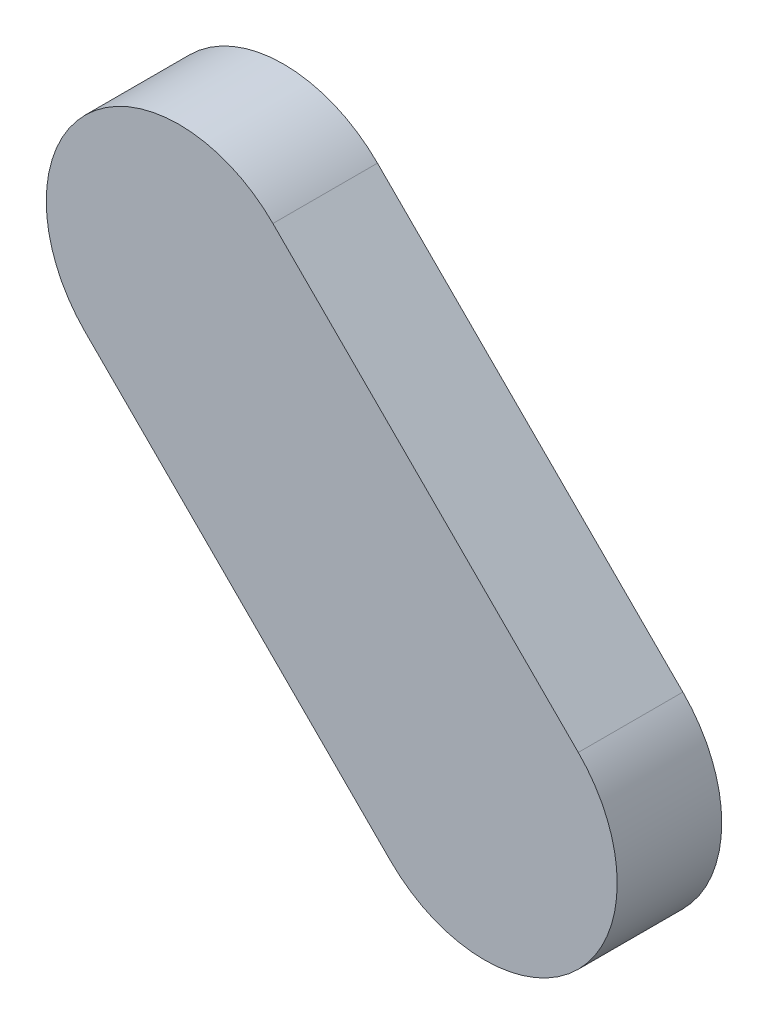
ISO-10303-21;
HEADER;
FILE_DESCRIPTION(('STEP AP214'),'2;1');
FILE_NAME('part.step','',(''),(''),'','','');
FILE_SCHEMA(('AUTOMOTIVE_DESIGN { 1 0 10303 214 1 1 1 1 }'));
ENDSEC;
DATA;
#1=APPLICATION_CONTEXT('core data for automotive mechanical design processes');
#2=APPLICATION_PROTOCOL_DEFINITION('international standard','automotive_design',2000,#1);
#3=PRODUCT_CONTEXT('',#1,'mechanical');
#4=PRODUCT('Part','Part','',(#3));
#5=PRODUCT_RELATED_PRODUCT_CATEGORY('part','',(#4));
#6=PRODUCT_DEFINITION_FORMATION('','',#4);
#7=PRODUCT_DEFINITION_CONTEXT('part definition',#1,'design');
#8=PRODUCT_DEFINITION('design','',#6,#7);
#9=PRODUCT_DEFINITION_SHAPE('','',#8);
#10=(LENGTH_UNIT() NAMED_UNIT(*) SI_UNIT(.MILLI.,.METRE.));
#11=(NAMED_UNIT(*) PLANE_ANGLE_UNIT() SI_UNIT($,.RADIAN.));
#12=(NAMED_UNIT(*) SI_UNIT($,.STERADIAN.) SOLID_ANGLE_UNIT());
#13=UNCERTAINTY_MEASURE_WITH_UNIT(LENGTH_MEASURE(1.E-05),#10,'distance_accuracy_value','');
#14=(GEOMETRIC_REPRESENTATION_CONTEXT(3) GLOBAL_UNCERTAINTY_ASSIGNED_CONTEXT((#13)) GLOBAL_UNIT_ASSIGNED_CONTEXT((#10,
#11,#12)) REPRESENTATION_CONTEXT('',''));
#15=CARTESIAN_POINT('',(0.,0.,0.));
#16=DIRECTION('',(0.,0.,1.));
#17=DIRECTION('',(1.,0.,0.));
#18=AXIS2_PLACEMENT_3D('',#15,#16,#17);
#19=CARTESIAN_POINT('',(137.99639406,56.9703966,0.));
#20=DIRECTION('',(0.70710678118653,0.707106781186565,0.));
#21=DIRECTION('',(0.707106781186565,-0.70710678118653,0.));
#22=AXIS2_PLACEMENT_3D('',#19,#20,#21);
#23=PLANE('',#22);
#24=DIRECTION('',(0.707106781186565,-0.70710678118653,0.));
#25=VECTOR('',#24,1.);
#26=CARTESIAN_POINT('',(137.99639406,56.9703966,0.1999996));
#27=LINE('',#26,#25);
#28=CARTESIAN_POINT('',(137.99639406,56.9703966,0.1999996));
#29=VERTEX_POINT('',#28);
#30=CARTESIAN_POINT('',(138.5805966,56.38619406,0.1999996));
#31=VERTEX_POINT('',#30);
#32=EDGE_CURVE('E11',#29,#31,#27,.T.);
#33=ORIENTED_EDGE('',*,*,#32,.F.);
#34=DIRECTION('',(0.,0.,1.));
#35=VECTOR('',#34,1.);
#36=CARTESIAN_POINT('',(137.99639406,56.9703966,0.));
#37=LINE('',#36,#35);
#38=CARTESIAN_POINT('',(137.99639406,56.9703966,0.));
#39=VERTEX_POINT('',#38);
#40=EDGE_CURVE('E24',#39,#29,#37,.T.);
#41=ORIENTED_EDGE('',*,*,#40,.F.);
#42=DIRECTION('',(0.707106781186565,-0.70710678118653,0.));
#43=VECTOR('',#42,1.);
#44=CARTESIAN_POINT('',(137.99639406,56.9703966,0.));
#45=LINE('',#44,#43);
#46=CARTESIAN_POINT('',(138.5805966,56.38619406,0.));
#47=VERTEX_POINT('',#46);
#48=EDGE_CURVE('E75',#39,#47,#45,.T.);
#49=ORIENTED_EDGE('',*,*,#48,.T.);
#50=DIRECTION('',(0.,0.,1.));
#51=VECTOR('',#50,1.);
#52=CARTESIAN_POINT('',(138.5805966,56.38619406,0.));
#53=LINE('',#52,#51);
#54=EDGE_CURVE('E37',#47,#31,#53,.T.);
#55=ORIENTED_EDGE('',*,*,#54,.T.);
#56=EDGE_LOOP('',(#33,#41,#49,#55));
#57=FACE_BOUND('',#56,.T.);
#58=ADVANCED_FACE('F17',(#57),#23,.F.);
#59=CARTESIAN_POINT('',(138.76020127,56.56579873,0.));
#60=DIRECTION('',(0.,0.,-1.));
#61=DIRECTION('',(-0.707106781186492,-0.707106781186603,0.));
#62=AXIS2_PLACEMENT_3D('',#59,#60,#61);
#63=CYLINDRICAL_SURFACE('',#62,0.253999360179542);
#64=CARTESIAN_POINT('',(138.76020127,56.56579873,0.1999996));
#65=DIRECTION('',(0.,0.,1.));
#66=DIRECTION('',(-0.707106781186492,-0.707106781186603,0.));
#67=AXIS2_PLACEMENT_3D('',#64,#65,#66);
#68=CIRCLE('',#67,0.253999360179542);
#69=CARTESIAN_POINT('',(138.93980594,56.7454034,0.1999996));
#70=VERTEX_POINT('',#69);
#71=EDGE_CURVE('E83',#31,#70,#68,.T.);
#72=ORIENTED_EDGE('',*,*,#71,.F.);
#73=ORIENTED_EDGE('',*,*,#54,.F.);
#74=CARTESIAN_POINT('',(138.76020127,56.56579873,0.));
#75=DIRECTION('',(0.,0.,1.));
#76=DIRECTION('',(-0.707106781186492,-0.707106781186603,0.));
#77=AXIS2_PLACEMENT_3D('',#74,#75,#76);
#78=CIRCLE('',#77,0.253999360179542);
#79=CARTESIAN_POINT('',(138.93980594,56.7454034,0.));
#80=VERTEX_POINT('',#79);
#81=EDGE_CURVE('E81',#47,#80,#78,.T.);
#82=ORIENTED_EDGE('',*,*,#81,.T.);
#83=DIRECTION('',(0.,0.,1.));
#84=VECTOR('',#83,1.);
#85=CARTESIAN_POINT('',(138.93980594,56.7454034,0.));
#86=LINE('',#85,#84);
#87=EDGE_CURVE('E67',#80,#70,#86,.T.);
#88=ORIENTED_EDGE('',*,*,#87,.T.);
#89=EDGE_LOOP('',(#72,#73,#82,#88));
#90=FACE_BOUND('',#89,.T.);
#91=ADVANCED_FACE('F89',(#90),#63,.T.);
#92=CARTESIAN_POINT('',(138.93980594,56.7454034,0.));
#93=DIRECTION('',(-0.707106781186561,-0.707106781186535,0.));
#94=DIRECTION('',(-0.707106781186535,0.707106781186561,0.));
#95=AXIS2_PLACEMENT_3D('',#92,#93,#94);
#96=PLANE('',#95);
#97=DIRECTION('',(-0.707106781186535,0.707106781186561,0.));
#98=VECTOR('',#97,1.);
#99=CARTESIAN_POINT('',(138.93980594,56.7454034,0.1999996));
#100=LINE('',#99,#98);
#101=CARTESIAN_POINT('',(138.3556034,57.32960594,0.1999996));
#102=VERTEX_POINT('',#101);
#103=EDGE_CURVE('E71',#70,#102,#100,.T.);
#104=ORIENTED_EDGE('',*,*,#103,.F.);
#105=ORIENTED_EDGE('',*,*,#87,.F.);
#106=DIRECTION('',(-0.707106781186535,0.707106781186561,0.));
#107=VECTOR('',#106,1.);
#108=CARTESIAN_POINT('',(138.93980594,56.7454034,0.));
#109=LINE('',#108,#107);
#110=CARTESIAN_POINT('',(138.3556034,57.32960594,0.));
#111=VERTEX_POINT('',#110);
#112=EDGE_CURVE('E63',#80,#111,#109,.T.);
#113=ORIENTED_EDGE('',*,*,#112,.T.);
#114=DIRECTION('',(0.,0.,1.));
#115=VECTOR('',#114,1.);
#116=CARTESIAN_POINT('',(138.3556034,57.32960594,0.));
#117=LINE('',#116,#115);
#118=EDGE_CURVE('E53',#111,#102,#117,.T.);
#119=ORIENTED_EDGE('',*,*,#118,.T.);
#120=EDGE_LOOP('',(#104,#105,#113,#119));
#121=FACE_BOUND('',#120,.T.);
#122=ADVANCED_FACE('F66',(#121),#96,.F.);
#123=CARTESIAN_POINT('',(138.17599873,57.15000127,0.));
#124=DIRECTION('',(0.,0.,-1.));
#125=DIRECTION('',(0.707106781186562,0.707106781186534,0.));
#126=AXIS2_PLACEMENT_3D('',#123,#124,#125);
#127=CYLINDRICAL_SURFACE('',#126,0.253999360179559);
#128=CARTESIAN_POINT('',(138.17599873,57.15000127,0.1999996));
#129=DIRECTION('',(0.,0.,1.));
#130=DIRECTION('',(0.707106781186562,0.707106781186534,0.));
#131=AXIS2_PLACEMENT_3D('',#128,#129,#130);
#132=CIRCLE('',#131,0.253999360179559);
#133=EDGE_CURVE('E59',#102,#29,#132,.T.);
#134=ORIENTED_EDGE('',*,*,#133,.F.);
#135=ORIENTED_EDGE('',*,*,#118,.F.);
#136=CARTESIAN_POINT('',(138.17599873,57.15000127,0.));
#137=DIRECTION('',(0.,0.,1.));
#138=DIRECTION('',(0.707106781186562,0.707106781186534,0.));
#139=AXIS2_PLACEMENT_3D('',#136,#137,#138);
#140=CIRCLE('',#139,0.253999360179559);
#141=EDGE_CURVE('E57',#111,#39,#140,.T.);
#142=ORIENTED_EDGE('',*,*,#141,.T.);
#143=ORIENTED_EDGE('',*,*,#40,.T.);
#144=EDGE_LOOP('',(#134,#135,#142,#143));
#145=FACE_BOUND('',#144,.T.);
#146=ADVANCED_FACE('F55',(#145),#127,.T.);
#147=CARTESIAN_POINT('',(137.99639406,56.9703966,0.));
#148=DIRECTION('',(0.,0.,-1.));
#149=DIRECTION('',(-1.,0.,0.));
#150=AXIS2_PLACEMENT_3D('',#147,#148,#149);
#151=PLANE('',#150);
#152=ORIENTED_EDGE('',*,*,#141,.F.);
#153=ORIENTED_EDGE('',*,*,#112,.F.);
#154=ORIENTED_EDGE('',*,*,#81,.F.);
#155=ORIENTED_EDGE('',*,*,#48,.F.);
#156=EDGE_LOOP('',(#152,#153,#154,#155));
#157=FACE_BOUND('',#156,.T.);
#158=ADVANCED_FACE('F74',(#157),#151,.T.);
#159=CARTESIAN_POINT('',(137.99639406,56.9703966,0.1999996));
#160=DIRECTION('',(0.,0.,-1.));
#161=DIRECTION('',(-1.,0.,0.));
#162=AXIS2_PLACEMENT_3D('',#159,#160,#161);
#163=PLANE('',#162);
#164=ORIENTED_EDGE('',*,*,#32,.T.);
#165=ORIENTED_EDGE('',*,*,#71,.T.);
#166=ORIENTED_EDGE('',*,*,#103,.T.);
#167=ORIENTED_EDGE('',*,*,#133,.T.);
#168=EDGE_LOOP('',(#164,#165,#166,#167));
#169=FACE_BOUND('',#168,.T.);
#170=ADVANCED_FACE('F91',(#169),#163,.F.);
#171=CLOSED_SHELL('',(#58,#91,#122,#146,#158,#170));
#172=MANIFOLD_SOLID_BREP('B1',#171);
#173=ADVANCED_BREP_SHAPE_REPRESENTATION('',(#18,#172),#14);
#174=SHAPE_DEFINITION_REPRESENTATION(#9,#173);
ENDSEC;
END-ISO-10303-21;
